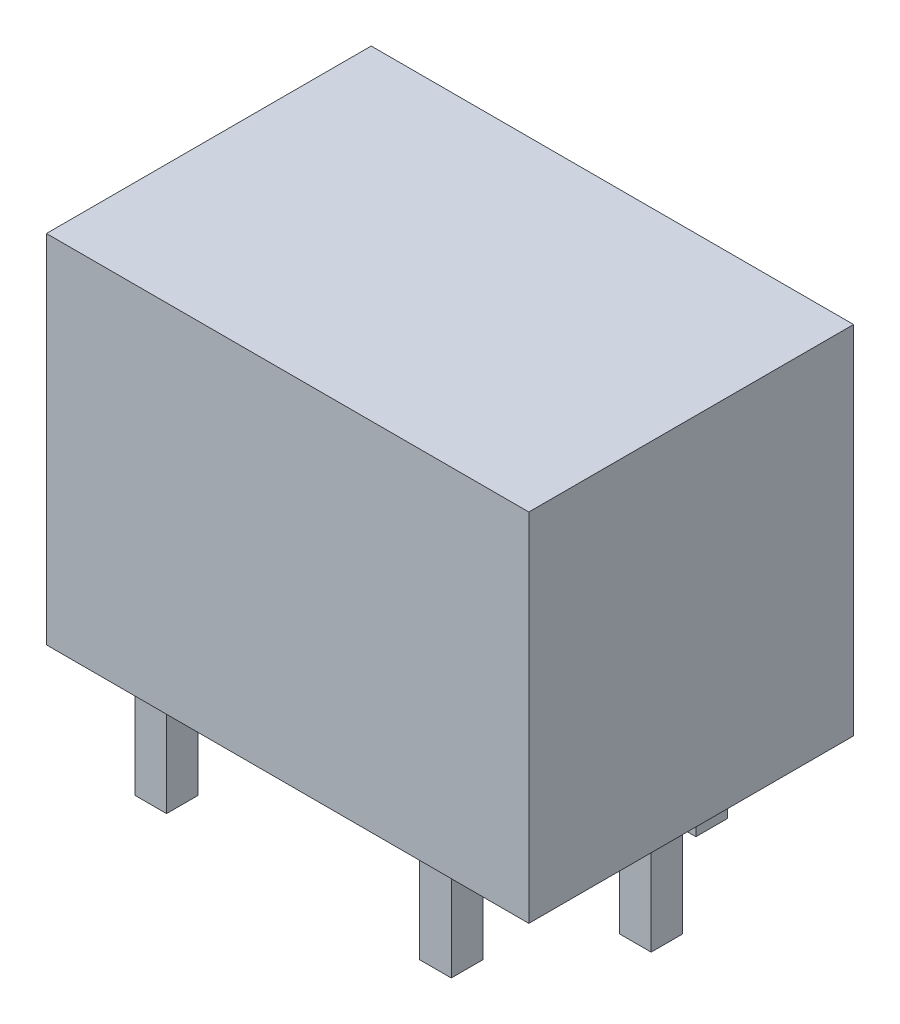
ISO-10303-21;
HEADER;
FILE_DESCRIPTION(('STEP AP214'),'2;1');
FILE_NAME('part.step','',(''),(''),'','','');
FILE_SCHEMA(('AUTOMOTIVE_DESIGN { 1 0 10303 214 1 1 1 1 }'));
ENDSEC;
DATA;
#1=APPLICATION_CONTEXT('core data for automotive mechanical design processes');
#2=APPLICATION_PROTOCOL_DEFINITION('international standard','automotive_design',2000,#1);
#3=PRODUCT_CONTEXT('',#1,'mechanical');
#4=PRODUCT('Part','Part','',(#3));
#5=PRODUCT_RELATED_PRODUCT_CATEGORY('part','',(#4));
#6=PRODUCT_DEFINITION_FORMATION('','',#4);
#7=PRODUCT_DEFINITION_CONTEXT('part definition',#1,'design');
#8=PRODUCT_DEFINITION('design','',#6,#7);
#9=PRODUCT_DEFINITION_SHAPE('','',#8);
#10=(LENGTH_UNIT() NAMED_UNIT(*) SI_UNIT(.MILLI.,.METRE.));
#11=(NAMED_UNIT(*) PLANE_ANGLE_UNIT() SI_UNIT($,.RADIAN.));
#12=(NAMED_UNIT(*) SI_UNIT($,.STERADIAN.) SOLID_ANGLE_UNIT());
#13=UNCERTAINTY_MEASURE_WITH_UNIT(LENGTH_MEASURE(1.E-05),#10,'distance_accuracy_value','');
#14=(GEOMETRIC_REPRESENTATION_CONTEXT(3) GLOBAL_UNCERTAINTY_ASSIGNED_CONTEXT((#13)) GLOBAL_UNIT_ASSIGNED_CONTEXT((#10,
#11,#12)) REPRESENTATION_CONTEXT('',''));
#15=CARTESIAN_POINT('',(0.,0.,0.));
#16=DIRECTION('',(0.,0.,1.));
#17=DIRECTION('',(1.,0.,0.));
#18=AXIS2_PLACEMENT_3D('',#15,#16,#17);
#19=CARTESIAN_POINT('',(-7.65,0.,5.15));
#20=DIRECTION('',(0.,1.,0.));
#21=DIRECTION('',(0.,0.,1.));
#22=AXIS2_PLACEMENT_3D('',#19,#20,#21);
#23=PLANE('',#22);
#24=DIRECTION('',(1.,0.,0.));
#25=VECTOR('',#24,1.);
#26=CARTESIAN_POINT('',(-4.60999999999999,0.,-4.38));
#27=LINE('',#26,#25);
#28=CARTESIAN_POINT('',(-5.60999999999999,0.,-4.38));
#29=VERTEX_POINT('',#28);
#30=CARTESIAN_POINT('',(-4.60999999999999,0.,-4.38));
#31=VERTEX_POINT('',#30);
#32=EDGE_CURVE('E224',#29,#31,#27,.T.);
#33=ORIENTED_EDGE('',*,*,#32,.F.);
#34=DIRECTION('',(0.,0.,-1.));
#35=VECTOR('',#34,1.);
#36=CARTESIAN_POINT('',(-5.60999999999999,0.,-4.38));
#37=LINE('',#36,#35);
#38=CARTESIAN_POINT('',(-5.60999999999999,0.,-3.38));
#39=VERTEX_POINT('',#38);
#40=EDGE_CURVE('E233',#39,#29,#37,.T.);
#41=ORIENTED_EDGE('',*,*,#40,.F.);
#42=DIRECTION('',(-1.,0.,0.));
#43=VECTOR('',#42,1.);
#44=CARTESIAN_POINT('',(-4.60999999999999,0.,-3.38));
#45=LINE('',#44,#43);
#46=CARTESIAN_POINT('',(-4.61,0.,-3.38));
#47=VERTEX_POINT('',#46);
#48=EDGE_CURVE('E230',#47,#39,#45,.T.);
#49=ORIENTED_EDGE('',*,*,#48,.F.);
#50=DIRECTION('',(0.,0.,1.));
#51=VECTOR('',#50,1.);
#52=CARTESIAN_POINT('',(-4.60999999999999,0.,-4.38));
#53=LINE('',#52,#51);
#54=EDGE_CURVE('E227',#31,#47,#53,.T.);
#55=ORIENTED_EDGE('',*,*,#54,.F.);
#56=EDGE_LOOP('',(#33,#41,#49,#55));
#57=FACE_BOUND('',#56,.T.);
#58=DIRECTION('',(0.,0.,1.));
#59=VECTOR('',#58,1.);
#60=CARTESIAN_POINT('',(4.42000000000001,0.,4.38));
#61=LINE('',#60,#59);
#62=CARTESIAN_POINT('',(4.42000000000001,0.,3.38));
#63=VERTEX_POINT('',#62);
#64=CARTESIAN_POINT('',(4.42000000000001,0.,4.38));
#65=VERTEX_POINT('',#64);
#66=EDGE_CURVE('E290',#63,#65,#61,.T.);
#67=ORIENTED_EDGE('',*,*,#66,.F.);
#68=DIRECTION('',(1.,0.,0.));
#69=VECTOR('',#68,1.);
#70=CARTESIAN_POINT('',(4.42000000000001,0.,3.38));
#71=LINE('',#70,#69);
#72=CARTESIAN_POINT('',(3.42000000000001,0.,3.38));
#73=VERTEX_POINT('',#72);
#74=EDGE_CURVE('E299',#73,#63,#71,.T.);
#75=ORIENTED_EDGE('',*,*,#74,.F.);
#76=DIRECTION('',(0.,0.,-1.));
#77=VECTOR('',#76,1.);
#78=CARTESIAN_POINT('',(3.42000000000001,0.,4.38));
#79=LINE('',#78,#77);
#80=CARTESIAN_POINT('',(3.42000000000001,0.,4.38));
#81=VERTEX_POINT('',#80);
#82=EDGE_CURVE('E296',#81,#73,#79,.T.);
#83=ORIENTED_EDGE('',*,*,#82,.F.);
#84=DIRECTION('',(-1.,0.,0.));
#85=VECTOR('',#84,1.);
#86=CARTESIAN_POINT('',(4.42000000000001,0.,4.38));
#87=LINE('',#86,#85);
#88=EDGE_CURVE('E293',#65,#81,#87,.T.);
#89=ORIENTED_EDGE('',*,*,#88,.F.);
#90=EDGE_LOOP('',(#67,#75,#83,#89));
#91=FACE_BOUND('',#90,.T.);
#92=DIRECTION('',(0.,0.,1.));
#93=VECTOR('',#92,1.);
#94=CARTESIAN_POINT('',(-7.65,0.,-5.15));
#95=LINE('',#94,#93);
#96=CARTESIAN_POINT('',(-7.65,0.,-5.15));
#97=VERTEX_POINT('',#96);
#98=CARTESIAN_POINT('',(-7.65,0.,5.15));
#99=VERTEX_POINT('',#98);
#100=EDGE_CURVE('E356',#97,#99,#95,.T.);
#101=ORIENTED_EDGE('',*,*,#100,.F.);
#102=DIRECTION('',(-1.,0.,0.));
#103=VECTOR('',#102,1.);
#104=CARTESIAN_POINT('',(-7.65,0.,-5.15));
#105=LINE('',#104,#103);
#106=CARTESIAN_POINT('',(7.65000000000001,0.,-5.15));
#107=VERTEX_POINT('',#106);
#108=EDGE_CURVE('E363',#107,#97,#105,.T.);
#109=ORIENTED_EDGE('',*,*,#108,.F.);
#110=DIRECTION('',(0.,0.,-1.));
#111=VECTOR('',#110,1.);
#112=CARTESIAN_POINT('',(7.65000000000001,0.,-5.15));
#113=LINE('',#112,#111);
#114=CARTESIAN_POINT('',(7.65000000000001,0.,5.15));
#115=VERTEX_POINT('',#114);
#116=EDGE_CURVE('E361',#115,#107,#113,.T.);
#117=ORIENTED_EDGE('',*,*,#116,.F.);
#118=DIRECTION('',(1.,0.,0.));
#119=VECTOR('',#118,1.);
#120=CARTESIAN_POINT('',(-7.65,0.,5.15));
#121=LINE('',#120,#119);
#122=EDGE_CURVE('E359',#99,#115,#121,.T.);
#123=ORIENTED_EDGE('',*,*,#122,.F.);
#124=EDGE_LOOP('',(#101,#109,#117,#123));
#125=FACE_BOUND('',#124,.T.);
#126=DIRECTION('',(0.,0.,1.));
#127=VECTOR('',#126,1.);
#128=CARTESIAN_POINT('',(6.88000000000001,0.,-0.499999999999999));
#129=LINE('',#128,#127);
#130=CARTESIAN_POINT('',(6.88000000000001,0.,-0.499999999999999));
#131=VERTEX_POINT('',#130);
#132=CARTESIAN_POINT('',(6.88000000000001,0.,0.500000000000008));
#133=VERTEX_POINT('',#132);
#134=EDGE_CURVE('E323',#131,#133,#129,.T.);
#135=ORIENTED_EDGE('',*,*,#134,.F.);
#136=DIRECTION('',(1.,0.,0.));
#137=VECTOR('',#136,1.);
#138=CARTESIAN_POINT('',(6.88000000000001,0.,-0.499999999999999));
#139=LINE('',#138,#137);
#140=CARTESIAN_POINT('',(5.88000000000001,0.,-0.499999999999999));
#141=VERTEX_POINT('',#140);
#142=EDGE_CURVE('E332',#141,#131,#139,.T.);
#143=ORIENTED_EDGE('',*,*,#142,.F.);
#144=DIRECTION('',(0.,0.,-1.));
#145=VECTOR('',#144,1.);
#146=CARTESIAN_POINT('',(5.88000000000001,0.,-0.499999999999999));
#147=LINE('',#146,#145);
#148=CARTESIAN_POINT('',(5.88000000000001,0.,0.500000000000008));
#149=VERTEX_POINT('',#148);
#150=EDGE_CURVE('E329',#149,#141,#147,.T.);
#151=ORIENTED_EDGE('',*,*,#150,.F.);
#152=DIRECTION('',(-1.,0.,0.));
#153=VECTOR('',#152,1.);
#154=CARTESIAN_POINT('',(6.88000000000001,0.,0.500000000000008));
#155=LINE('',#154,#153);
#156=EDGE_CURVE('E326',#133,#149,#155,.T.);
#157=ORIENTED_EDGE('',*,*,#156,.F.);
#158=EDGE_LOOP('',(#135,#143,#151,#157));
#159=FACE_BOUND('',#158,.T.);
#160=DIRECTION('',(0.,0.,1.));
#161=VECTOR('',#160,1.);
#162=CARTESIAN_POINT('',(-4.61,0.,4.38));
#163=LINE('',#162,#161);
#164=CARTESIAN_POINT('',(-4.61,0.,3.38));
#165=VERTEX_POINT('',#164);
#166=CARTESIAN_POINT('',(-4.61,0.,4.38));
#167=VERTEX_POINT('',#166);
#168=EDGE_CURVE('E257',#165,#167,#163,.T.);
#169=ORIENTED_EDGE('',*,*,#168,.F.);
#170=DIRECTION('',(1.,0.,0.));
#171=VECTOR('',#170,1.);
#172=CARTESIAN_POINT('',(-4.61,0.,3.38));
#173=LINE('',#172,#171);
#174=CARTESIAN_POINT('',(-5.61,0.,3.38));
#175=VERTEX_POINT('',#174);
#176=EDGE_CURVE('E266',#175,#165,#173,.T.);
#177=ORIENTED_EDGE('',*,*,#176,.F.);
#178=DIRECTION('',(0.,0.,-1.));
#179=VECTOR('',#178,1.);
#180=CARTESIAN_POINT('',(-5.61,0.,4.38));
#181=LINE('',#180,#179);
#182=CARTESIAN_POINT('',(-5.61,0.,4.38));
#183=VERTEX_POINT('',#182);
#184=EDGE_CURVE('E263',#183,#175,#181,.T.);
#185=ORIENTED_EDGE('',*,*,#184,.F.);
#186=DIRECTION('',(-1.,0.,0.));
#187=VECTOR('',#186,1.);
#188=CARTESIAN_POINT('',(-4.61,0.,4.38));
#189=LINE('',#188,#187);
#190=EDGE_CURVE('E260',#167,#183,#189,.T.);
#191=ORIENTED_EDGE('',*,*,#190,.F.);
#192=EDGE_LOOP('',(#169,#177,#185,#191));
#193=FACE_BOUND('',#192,.T.);
#194=DIRECTION('',(1.,0.,0.));
#195=VECTOR('',#194,1.);
#196=CARTESIAN_POINT('',(4.42000000000001,0.,-4.38));
#197=LINE('',#196,#195);
#198=CARTESIAN_POINT('',(3.42000000000001,0.,-4.38));
#199=VERTEX_POINT('',#198);
#200=CARTESIAN_POINT('',(4.42000000000001,0.,-4.38));
#201=VERTEX_POINT('',#200);
#202=EDGE_CURVE('E192',#199,#201,#197,.T.);
#203=ORIENTED_EDGE('',*,*,#202,.F.);
#204=DIRECTION('',(0.,0.,-1.));
#205=VECTOR('',#204,1.);
#206=CARTESIAN_POINT('',(3.42000000000001,0.,-4.38));
#207=LINE('',#206,#205);
#208=CARTESIAN_POINT('',(3.42000000000001,0.,-3.38));
#209=VERTEX_POINT('',#208);
#210=EDGE_CURVE('E194',#209,#199,#207,.T.);
#211=ORIENTED_EDGE('',*,*,#210,.F.);
#212=DIRECTION('',(-1.,0.,0.));
#213=VECTOR('',#212,1.);
#214=CARTESIAN_POINT('',(4.42000000000001,0.,-3.38));
#215=LINE('',#214,#213);
#216=CARTESIAN_POINT('',(4.42000000000001,0.,-3.38));
#217=VERTEX_POINT('',#216);
#218=EDGE_CURVE('E55',#217,#209,#215,.T.);
#219=ORIENTED_EDGE('',*,*,#218,.F.);
#220=DIRECTION('',(0.,0.,1.));
#221=VECTOR('',#220,1.);
#222=CARTESIAN_POINT('',(4.42000000000001,0.,-4.38));
#223=LINE('',#222,#221);
#224=EDGE_CURVE('E50',#201,#217,#223,.T.);
#225=ORIENTED_EDGE('',*,*,#224,.F.);
#226=EDGE_LOOP('',(#203,#211,#219,#225));
#227=FACE_BOUND('',#226,.T.);
#228=ADVANCED_FACE('F35',(#57,#91,#125,#159,#193,#227),#23,.F.);
#229=CARTESIAN_POINT('',(-7.65,11.3,-5.15));
#230=DIRECTION('',(1.,0.,0.));
#231=DIRECTION('',(0.,0.,-1.));
#232=AXIS2_PLACEMENT_3D('',#229,#230,#231);
#233=PLANE('',#232);
#234=ORIENTED_EDGE('',*,*,#100,.T.);
#235=DIRECTION('',(0.,-1.,0.));
#236=VECTOR('',#235,1.);
#237=CARTESIAN_POINT('',(-7.65,11.3,5.15));
#238=LINE('',#237,#236);
#239=CARTESIAN_POINT('',(-7.65,11.3,5.15));
#240=VERTEX_POINT('',#239);
#241=EDGE_CURVE('E11',#240,#99,#238,.T.);
#242=ORIENTED_EDGE('',*,*,#241,.F.);
#243=DIRECTION('',(0.,0.,1.));
#244=VECTOR('',#243,1.);
#245=CARTESIAN_POINT('',(-7.65,11.3,-5.15));
#246=LINE('',#245,#244);
#247=CARTESIAN_POINT('',(-7.65,11.3,-5.15));
#248=VERTEX_POINT('',#247);
#249=EDGE_CURVE('E365',#248,#240,#246,.T.);
#250=ORIENTED_EDGE('',*,*,#249,.F.);
#251=DIRECTION('',(0.,-1.,0.));
#252=VECTOR('',#251,1.);
#253=CARTESIAN_POINT('',(-7.65,11.3,-5.15));
#254=LINE('',#253,#252);
#255=EDGE_CURVE('E374',#248,#97,#254,.T.);
#256=ORIENTED_EDGE('',*,*,#255,.T.);
#257=EDGE_LOOP('',(#234,#242,#250,#256));
#258=FACE_BOUND('',#257,.T.);
#259=ADVANCED_FACE('F37',(#258),#233,.F.);
#260=CARTESIAN_POINT('',(-7.65,11.3,5.15));
#261=DIRECTION('',(0.,0.,-1.));
#262=DIRECTION('',(-1.,0.,0.));
#263=AXIS2_PLACEMENT_3D('',#260,#261,#262);
#264=PLANE('',#263);
#265=ORIENTED_EDGE('',*,*,#122,.T.);
#266=DIRECTION('',(0.,-1.,0.));
#267=VECTOR('',#266,1.);
#268=CARTESIAN_POINT('',(7.65000000000001,11.3,5.15));
#269=LINE('',#268,#267);
#270=CARTESIAN_POINT('',(7.65000000000001,11.3,5.15));
#271=VERTEX_POINT('',#270);
#272=EDGE_CURVE('E43',#271,#115,#269,.T.);
#273=ORIENTED_EDGE('',*,*,#272,.F.);
#274=DIRECTION('',(1.,0.,0.));
#275=VECTOR('',#274,1.);
#276=CARTESIAN_POINT('',(-7.65,11.3,5.15));
#277=LINE('',#276,#275);
#278=EDGE_CURVE('E368',#240,#271,#277,.T.);
#279=ORIENTED_EDGE('',*,*,#278,.F.);
#280=ORIENTED_EDGE('',*,*,#241,.T.);
#281=EDGE_LOOP('',(#265,#273,#279,#280));
#282=FACE_BOUND('',#281,.T.);
#283=ADVANCED_FACE('F400',(#282),#264,.F.);
#284=CARTESIAN_POINT('',(7.65000000000001,11.3,-5.15));
#285=DIRECTION('',(-1.,0.,0.));
#286=DIRECTION('',(0.,0.,1.));
#287=AXIS2_PLACEMENT_3D('',#284,#285,#286);
#288=PLANE('',#287);
#289=ORIENTED_EDGE('',*,*,#116,.T.);
#290=DIRECTION('',(0.,-1.,0.));
#291=VECTOR('',#290,1.);
#292=CARTESIAN_POINT('',(7.65000000000001,11.3,-5.15));
#293=LINE('',#292,#291);
#294=CARTESIAN_POINT('',(7.65000000000001,11.3,-5.15));
#295=VERTEX_POINT('',#294);
#296=EDGE_CURVE('E377',#295,#107,#293,.T.);
#297=ORIENTED_EDGE('',*,*,#296,.F.);
#298=DIRECTION('',(0.,0.,-1.));
#299=VECTOR('',#298,1.);
#300=CARTESIAN_POINT('',(7.65000000000001,11.3,-5.15));
#301=LINE('',#300,#299);
#302=EDGE_CURVE('E370',#271,#295,#301,.T.);
#303=ORIENTED_EDGE('',*,*,#302,.F.);
#304=ORIENTED_EDGE('',*,*,#272,.T.);
#305=EDGE_LOOP('',(#289,#297,#303,#304));
#306=FACE_BOUND('',#305,.T.);
#307=ADVANCED_FACE('F384',(#306),#288,.F.);
#308=CARTESIAN_POINT('',(-7.65,11.3,-5.15));
#309=DIRECTION('',(0.,0.,1.));
#310=DIRECTION('',(1.,0.,0.));
#311=AXIS2_PLACEMENT_3D('',#308,#309,#310);
#312=PLANE('',#311);
#313=ORIENTED_EDGE('',*,*,#108,.T.);
#314=ORIENTED_EDGE('',*,*,#255,.F.);
#315=DIRECTION('',(-1.,0.,0.));
#316=VECTOR('',#315,1.);
#317=CARTESIAN_POINT('',(-7.65,11.3,-5.15));
#318=LINE('',#317,#316);
#319=EDGE_CURVE('E372',#295,#248,#318,.T.);
#320=ORIENTED_EDGE('',*,*,#319,.F.);
#321=ORIENTED_EDGE('',*,*,#296,.T.);
#322=EDGE_LOOP('',(#313,#314,#320,#321));
#323=FACE_BOUND('',#322,.T.);
#324=ADVANCED_FACE('F393',(#323),#312,.F.);
#325=CARTESIAN_POINT('',(-7.65,11.3,5.15));
#326=DIRECTION('',(0.,1.,0.));
#327=DIRECTION('',(0.,0.,1.));
#328=AXIS2_PLACEMENT_3D('',#325,#326,#327);
#329=PLANE('',#328);
#330=ORIENTED_EDGE('',*,*,#249,.T.);
#331=ORIENTED_EDGE('',*,*,#278,.T.);
#332=ORIENTED_EDGE('',*,*,#302,.T.);
#333=ORIENTED_EDGE('',*,*,#319,.T.);
#334=EDGE_LOOP('',(#330,#331,#332,#333));
#335=FACE_BOUND('',#334,.T.);
#336=ADVANCED_FACE('F399',(#335),#329,.T.);
#337=CARTESIAN_POINT('',(6.88000000000001,-3.5,-0.499999999999999));
#338=DIRECTION('',(-1.,0.,0.));
#339=DIRECTION('',(0.,0.,1.));
#340=AXIS2_PLACEMENT_3D('',#337,#338,#339);
#341=PLANE('',#340);
#342=ORIENTED_EDGE('',*,*,#134,.T.);
#343=DIRECTION('',(0.,1.,0.));
#344=VECTOR('',#343,1.);
#345=CARTESIAN_POINT('',(6.88000000000001,-3.5,0.500000000000008));
#346=LINE('',#345,#344);
#347=CARTESIAN_POINT('',(6.88000000000001,-3.5,0.500000000000008));
#348=VERTEX_POINT('',#347);
#349=EDGE_CURVE('E353',#348,#133,#346,.T.);
#350=ORIENTED_EDGE('',*,*,#349,.F.);
#351=DIRECTION('',(0.,0.,1.));
#352=VECTOR('',#351,1.);
#353=CARTESIAN_POINT('',(6.88000000000001,-3.5,-0.499999999999999));
#354=LINE('',#353,#352);
#355=CARTESIAN_POINT('',(6.88000000000001,-3.5,-0.499999999999999));
#356=VERTEX_POINT('',#355);
#357=EDGE_CURVE('E335',#356,#348,#354,.T.);
#358=ORIENTED_EDGE('',*,*,#357,.F.);
#359=DIRECTION('',(0.,1.,0.));
#360=VECTOR('',#359,1.);
#361=CARTESIAN_POINT('',(6.88000000000001,-3.5,-0.499999999999999));
#362=LINE('',#361,#360);
#363=EDGE_CURVE('E344',#356,#131,#362,.T.);
#364=ORIENTED_EDGE('',*,*,#363,.T.);
#365=EDGE_LOOP('',(#342,#350,#358,#364));
#366=FACE_BOUND('',#365,.T.);
#367=ADVANCED_FACE('F415',(#366),#341,.F.);
#368=CARTESIAN_POINT('',(6.88000000000001,-3.5,0.500000000000008));
#369=DIRECTION('',(0.,0.,-1.));
#370=DIRECTION('',(-1.,0.,0.));
#371=AXIS2_PLACEMENT_3D('',#368,#369,#370);
#372=PLANE('',#371);
#373=ORIENTED_EDGE('',*,*,#156,.T.);
#374=DIRECTION('',(0.,1.,0.));
#375=VECTOR('',#374,1.);
#376=CARTESIAN_POINT('',(5.88000000000001,-3.5,0.500000000000008));
#377=LINE('',#376,#375);
#378=CARTESIAN_POINT('',(5.88000000000001,-3.5,0.500000000000008));
#379=VERTEX_POINT('',#378);
#380=EDGE_CURVE('E350',#379,#149,#377,.T.);
#381=ORIENTED_EDGE('',*,*,#380,.F.);
#382=DIRECTION('',(-1.,0.,0.));
#383=VECTOR('',#382,1.);
#384=CARTESIAN_POINT('',(6.88000000000001,-3.5,0.500000000000008));
#385=LINE('',#384,#383);
#386=EDGE_CURVE('E338',#348,#379,#385,.T.);
#387=ORIENTED_EDGE('',*,*,#386,.F.);
#388=ORIENTED_EDGE('',*,*,#349,.T.);
#389=EDGE_LOOP('',(#373,#381,#387,#388));
#390=FACE_BOUND('',#389,.T.);
#391=ADVANCED_FACE('F434',(#390),#372,.F.);
#392=CARTESIAN_POINT('',(5.88000000000001,-3.5,-0.499999999999999));
#393=DIRECTION('',(1.,0.,0.));
#394=DIRECTION('',(0.,0.,-1.));
#395=AXIS2_PLACEMENT_3D('',#392,#393,#394);
#396=PLANE('',#395);
#397=ORIENTED_EDGE('',*,*,#150,.T.);
#398=DIRECTION('',(0.,1.,0.));
#399=VECTOR('',#398,1.);
#400=CARTESIAN_POINT('',(5.88000000000001,-3.5,-0.499999999999999));
#401=LINE('',#400,#399);
#402=CARTESIAN_POINT('',(5.88000000000001,-3.5,-0.499999999999999));
#403=VERTEX_POINT('',#402);
#404=EDGE_CURVE('E347',#403,#141,#401,.T.);
#405=ORIENTED_EDGE('',*,*,#404,.F.);
#406=DIRECTION('',(0.,0.,-1.));
#407=VECTOR('',#406,1.);
#408=CARTESIAN_POINT('',(5.88000000000001,-3.5,-0.499999999999999));
#409=LINE('',#408,#407);
#410=EDGE_CURVE('E340',#379,#403,#409,.T.);
#411=ORIENTED_EDGE('',*,*,#410,.F.);
#412=ORIENTED_EDGE('',*,*,#380,.T.);
#413=EDGE_LOOP('',(#397,#405,#411,#412));
#414=FACE_BOUND('',#413,.T.);
#415=ADVANCED_FACE('F441',(#414),#396,.F.);
#416=CARTESIAN_POINT('',(6.88000000000001,-3.5,-0.499999999999999));
#417=DIRECTION('',(0.,0.,1.));
#418=DIRECTION('',(1.,0.,0.));
#419=AXIS2_PLACEMENT_3D('',#416,#417,#418);
#420=PLANE('',#419);
#421=ORIENTED_EDGE('',*,*,#142,.T.);
#422=ORIENTED_EDGE('',*,*,#363,.F.);
#423=DIRECTION('',(1.,0.,0.));
#424=VECTOR('',#423,1.);
#425=CARTESIAN_POINT('',(6.88000000000001,-3.5,-0.499999999999999));
#426=LINE('',#425,#424);
#427=EDGE_CURVE('E342',#403,#356,#426,.T.);
#428=ORIENTED_EDGE('',*,*,#427,.F.);
#429=ORIENTED_EDGE('',*,*,#404,.T.);
#430=EDGE_LOOP('',(#421,#422,#428,#429));
#431=FACE_BOUND('',#430,.T.);
#432=ADVANCED_FACE('F448',(#431),#420,.F.);
#433=CARTESIAN_POINT('',(6.88000000000001,-3.5,0.500000000000008));
#434=DIRECTION('',(0.,-1.,0.));
#435=DIRECTION('',(0.,0.,-1.));
#436=AXIS2_PLACEMENT_3D('',#433,#434,#435);
#437=PLANE('',#436);
#438=ORIENTED_EDGE('',*,*,#357,.T.);
#439=ORIENTED_EDGE('',*,*,#386,.T.);
#440=ORIENTED_EDGE('',*,*,#410,.T.);
#441=ORIENTED_EDGE('',*,*,#427,.T.);
#442=EDGE_LOOP('',(#438,#439,#440,#441));
#443=FACE_BOUND('',#442,.T.);
#444=ADVANCED_FACE('F456',(#443),#437,.T.);
#445=CARTESIAN_POINT('',(4.42000000000001,-3.5,4.38));
#446=DIRECTION('',(-1.,0.,0.));
#447=DIRECTION('',(0.,0.,1.));
#448=AXIS2_PLACEMENT_3D('',#445,#446,#447);
#449=PLANE('',#448);
#450=ORIENTED_EDGE('',*,*,#66,.T.);
#451=DIRECTION('',(0.,1.,0.));
#452=VECTOR('',#451,1.);
#453=CARTESIAN_POINT('',(4.42000000000001,-3.5,4.38));
#454=LINE('',#453,#452);
#455=CARTESIAN_POINT('',(4.42000000000001,-3.5,4.38));
#456=VERTEX_POINT('',#455);
#457=EDGE_CURVE('E320',#456,#65,#454,.T.);
#458=ORIENTED_EDGE('',*,*,#457,.F.);
#459=DIRECTION('',(0.,0.,1.));
#460=VECTOR('',#459,1.);
#461=CARTESIAN_POINT('',(4.42000000000001,-3.5,4.38));
#462=LINE('',#461,#460);
#463=CARTESIAN_POINT('',(4.42000000000001,-3.5,3.38));
#464=VERTEX_POINT('',#463);
#465=EDGE_CURVE('E302',#464,#456,#462,.T.);
#466=ORIENTED_EDGE('',*,*,#465,.F.);
#467=DIRECTION('',(0.,1.,0.));
#468=VECTOR('',#467,1.);
#469=CARTESIAN_POINT('',(4.42000000000001,-3.5,3.38));
#470=LINE('',#469,#468);
#471=EDGE_CURVE('E311',#464,#63,#470,.T.);
#472=ORIENTED_EDGE('',*,*,#471,.T.);
#473=EDGE_LOOP('',(#450,#458,#466,#472));
#474=FACE_BOUND('',#473,.T.);
#475=ADVANCED_FACE('F464',(#474),#449,.F.);
#476=CARTESIAN_POINT('',(4.42000000000001,-3.5,4.38));
#477=DIRECTION('',(0.,0.,-1.));
#478=DIRECTION('',(-1.,0.,0.));
#479=AXIS2_PLACEMENT_3D('',#476,#477,#478);
#480=PLANE('',#479);
#481=ORIENTED_EDGE('',*,*,#88,.T.);
#482=DIRECTION('',(0.,1.,0.));
#483=VECTOR('',#482,1.);
#484=CARTESIAN_POINT('',(3.42000000000001,-3.5,4.38));
#485=LINE('',#484,#483);
#486=CARTESIAN_POINT('',(3.42000000000001,-3.5,4.38));
#487=VERTEX_POINT('',#486);
#488=EDGE_CURVE('E317',#487,#81,#485,.T.);
#489=ORIENTED_EDGE('',*,*,#488,.F.);
#490=DIRECTION('',(-1.,0.,0.));
#491=VECTOR('',#490,1.);
#492=CARTESIAN_POINT('',(4.42000000000001,-3.5,4.38));
#493=LINE('',#492,#491);
#494=EDGE_CURVE('E305',#456,#487,#493,.T.);
#495=ORIENTED_EDGE('',*,*,#494,.F.);
#496=ORIENTED_EDGE('',*,*,#457,.T.);
#497=EDGE_LOOP('',(#481,#489,#495,#496));
#498=FACE_BOUND('',#497,.T.);
#499=ADVANCED_FACE('F472',(#498),#480,.F.);
#500=CARTESIAN_POINT('',(3.42000000000001,-3.5,4.38));
#501=DIRECTION('',(1.,0.,0.));
#502=DIRECTION('',(0.,0.,-1.));
#503=AXIS2_PLACEMENT_3D('',#500,#501,#502);
#504=PLANE('',#503);
#505=ORIENTED_EDGE('',*,*,#82,.T.);
#506=DIRECTION('',(0.,1.,0.));
#507=VECTOR('',#506,1.);
#508=CARTESIAN_POINT('',(3.42000000000001,-3.5,3.38));
#509=LINE('',#508,#507);
#510=CARTESIAN_POINT('',(3.42000000000001,-3.5,3.38));
#511=VERTEX_POINT('',#510);
#512=EDGE_CURVE('E314',#511,#73,#509,.T.);
#513=ORIENTED_EDGE('',*,*,#512,.F.);
#514=DIRECTION('',(0.,0.,-1.));
#515=VECTOR('',#514,1.);
#516=CARTESIAN_POINT('',(3.42000000000001,-3.5,4.38));
#517=LINE('',#516,#515);
#518=EDGE_CURVE('E307',#487,#511,#517,.T.);
#519=ORIENTED_EDGE('',*,*,#518,.F.);
#520=ORIENTED_EDGE('',*,*,#488,.T.);
#521=EDGE_LOOP('',(#505,#513,#519,#520));
#522=FACE_BOUND('',#521,.T.);
#523=ADVANCED_FACE('F480',(#522),#504,.F.);
#524=CARTESIAN_POINT('',(4.42000000000001,-3.5,3.38));
#525=DIRECTION('',(0.,0.,1.));
#526=DIRECTION('',(1.,0.,0.));
#527=AXIS2_PLACEMENT_3D('',#524,#525,#526);
#528=PLANE('',#527);
#529=ORIENTED_EDGE('',*,*,#74,.T.);
#530=ORIENTED_EDGE('',*,*,#471,.F.);
#531=DIRECTION('',(1.,0.,0.));
#532=VECTOR('',#531,1.);
#533=CARTESIAN_POINT('',(4.42000000000001,-3.5,3.38));
#534=LINE('',#533,#532);
#535=EDGE_CURVE('E309',#511,#464,#534,.T.);
#536=ORIENTED_EDGE('',*,*,#535,.F.);
#537=ORIENTED_EDGE('',*,*,#512,.T.);
#538=EDGE_LOOP('',(#529,#530,#536,#537));
#539=FACE_BOUND('',#538,.T.);
#540=ADVANCED_FACE('F488',(#539),#528,.F.);
#541=CARTESIAN_POINT('',(4.42000000000001,-3.5,4.38));
#542=DIRECTION('',(0.,1.,0.));
#543=DIRECTION('',(0.,0.,1.));
#544=AXIS2_PLACEMENT_3D('',#541,#542,#543);
#545=PLANE('',#544);
#546=ORIENTED_EDGE('',*,*,#465,.T.);
#547=ORIENTED_EDGE('',*,*,#494,.T.);
#548=ORIENTED_EDGE('',*,*,#518,.T.);
#549=ORIENTED_EDGE('',*,*,#535,.T.);
#550=EDGE_LOOP('',(#546,#547,#548,#549));
#551=FACE_BOUND('',#550,.T.);
#552=ADVANCED_FACE('F496',(#551),#545,.F.);
#553=CARTESIAN_POINT('',(-4.61,-3.5,4.38));
#554=DIRECTION('',(-1.,0.,0.));
#555=DIRECTION('',(0.,0.,1.));
#556=AXIS2_PLACEMENT_3D('',#553,#554,#555);
#557=PLANE('',#556);
#558=ORIENTED_EDGE('',*,*,#168,.T.);
#559=DIRECTION('',(0.,1.,0.));
#560=VECTOR('',#559,1.);
#561=CARTESIAN_POINT('',(-4.61,-3.5,4.38));
#562=LINE('',#561,#560);
#563=CARTESIAN_POINT('',(-4.61,-3.5,4.38));
#564=VERTEX_POINT('',#563);
#565=EDGE_CURVE('E287',#564,#167,#562,.T.);
#566=ORIENTED_EDGE('',*,*,#565,.F.);
#567=DIRECTION('',(0.,0.,1.));
#568=VECTOR('',#567,1.);
#569=CARTESIAN_POINT('',(-4.61,-3.5,4.38));
#570=LINE('',#569,#568);
#571=CARTESIAN_POINT('',(-4.61,-3.5,3.38));
#572=VERTEX_POINT('',#571);
#573=EDGE_CURVE('E269',#572,#564,#570,.T.);
#574=ORIENTED_EDGE('',*,*,#573,.F.);
#575=DIRECTION('',(0.,1.,0.));
#576=VECTOR('',#575,1.);
#577=CARTESIAN_POINT('',(-4.61,-3.5,3.38));
#578=LINE('',#577,#576);
#579=EDGE_CURVE('E278',#572,#165,#578,.T.);
#580=ORIENTED_EDGE('',*,*,#579,.T.);
#581=EDGE_LOOP('',(#558,#566,#574,#580));
#582=FACE_BOUND('',#581,.T.);
#583=ADVANCED_FACE('F504',(#582),#557,.F.);
#584=CARTESIAN_POINT('',(-4.61,-3.5,4.38));
#585=DIRECTION('',(0.,0.,-1.));
#586=DIRECTION('',(-1.,0.,0.));
#587=AXIS2_PLACEMENT_3D('',#584,#585,#586);
#588=PLANE('',#587);
#589=ORIENTED_EDGE('',*,*,#190,.T.);
#590=DIRECTION('',(0.,1.,0.));
#591=VECTOR('',#590,1.);
#592=CARTESIAN_POINT('',(-5.61,-3.5,4.38));
#593=LINE('',#592,#591);
#594=CARTESIAN_POINT('',(-5.61,-3.5,4.38));
#595=VERTEX_POINT('',#594);
#596=EDGE_CURVE('E284',#595,#183,#593,.T.);
#597=ORIENTED_EDGE('',*,*,#596,.F.);
#598=DIRECTION('',(-1.,0.,0.));
#599=VECTOR('',#598,1.);
#600=CARTESIAN_POINT('',(-4.61,-3.5,4.38));
#601=LINE('',#600,#599);
#602=EDGE_CURVE('E272',#564,#595,#601,.T.);
#603=ORIENTED_EDGE('',*,*,#602,.F.);
#604=ORIENTED_EDGE('',*,*,#565,.T.);
#605=EDGE_LOOP('',(#589,#597,#603,#604));
#606=FACE_BOUND('',#605,.T.);
#607=ADVANCED_FACE('F512',(#606),#588,.F.);
#608=CARTESIAN_POINT('',(-5.61,-3.5,4.38));
#609=DIRECTION('',(1.,0.,0.));
#610=DIRECTION('',(0.,0.,-1.));
#611=AXIS2_PLACEMENT_3D('',#608,#609,#610);
#612=PLANE('',#611);
#613=ORIENTED_EDGE('',*,*,#184,.T.);
#614=DIRECTION('',(0.,1.,0.));
#615=VECTOR('',#614,1.);
#616=CARTESIAN_POINT('',(-5.61,-3.5,3.38));
#617=LINE('',#616,#615);
#618=CARTESIAN_POINT('',(-5.61,-3.5,3.38));
#619=VERTEX_POINT('',#618);
#620=EDGE_CURVE('E281',#619,#175,#617,.T.);
#621=ORIENTED_EDGE('',*,*,#620,.F.);
#622=DIRECTION('',(0.,0.,-1.));
#623=VECTOR('',#622,1.);
#624=CARTESIAN_POINT('',(-5.61,-3.5,4.38));
#625=LINE('',#624,#623);
#626=EDGE_CURVE('E274',#595,#619,#625,.T.);
#627=ORIENTED_EDGE('',*,*,#626,.F.);
#628=ORIENTED_EDGE('',*,*,#596,.T.);
#629=EDGE_LOOP('',(#613,#621,#627,#628));
#630=FACE_BOUND('',#629,.T.);
#631=ADVANCED_FACE('F520',(#630),#612,.F.);
#632=CARTESIAN_POINT('',(-4.61,-3.5,3.38));
#633=DIRECTION('',(0.,0.,1.));
#634=DIRECTION('',(1.,0.,0.));
#635=AXIS2_PLACEMENT_3D('',#632,#633,#634);
#636=PLANE('',#635);
#637=ORIENTED_EDGE('',*,*,#176,.T.);
#638=ORIENTED_EDGE('',*,*,#579,.F.);
#639=DIRECTION('',(1.,0.,0.));
#640=VECTOR('',#639,1.);
#641=CARTESIAN_POINT('',(-4.61,-3.5,3.38));
#642=LINE('',#641,#640);
#643=EDGE_CURVE('E276',#619,#572,#642,.T.);
#644=ORIENTED_EDGE('',*,*,#643,.F.);
#645=ORIENTED_EDGE('',*,*,#620,.T.);
#646=EDGE_LOOP('',(#637,#638,#644,#645));
#647=FACE_BOUND('',#646,.T.);
#648=ADVANCED_FACE('F528',(#647),#636,.F.);
#649=CARTESIAN_POINT('',(-4.61,-3.5,3.38));
#650=DIRECTION('',(0.,1.,0.));
#651=DIRECTION('',(0.,0.,1.));
#652=AXIS2_PLACEMENT_3D('',#649,#650,#651);
#653=PLANE('',#652);
#654=ORIENTED_EDGE('',*,*,#573,.T.);
#655=ORIENTED_EDGE('',*,*,#602,.T.);
#656=ORIENTED_EDGE('',*,*,#626,.T.);
#657=ORIENTED_EDGE('',*,*,#643,.T.);
#658=EDGE_LOOP('',(#654,#655,#656,#657));
#659=FACE_BOUND('',#658,.T.);
#660=ADVANCED_FACE('F536',(#659),#653,.F.);
#661=CARTESIAN_POINT('',(-4.60999999999999,-3.5,-4.38));
#662=DIRECTION('',(0.,0.,1.));
#663=DIRECTION('',(1.,0.,0.));
#664=AXIS2_PLACEMENT_3D('',#661,#662,#663);
#665=PLANE('',#664);
#666=ORIENTED_EDGE('',*,*,#32,.T.);
#667=DIRECTION('',(0.,1.,0.));
#668=VECTOR('',#667,1.);
#669=CARTESIAN_POINT('',(-4.60999999999999,-3.5,-4.38));
#670=LINE('',#669,#668);
#671=CARTESIAN_POINT('',(-4.60999999999999,-3.5,-4.38));
#672=VERTEX_POINT('',#671);
#673=EDGE_CURVE('E254',#672,#31,#670,.T.);
#674=ORIENTED_EDGE('',*,*,#673,.F.);
#675=DIRECTION('',(1.,0.,0.));
#676=VECTOR('',#675,1.);
#677=CARTESIAN_POINT('',(-4.60999999999999,-3.5,-4.38));
#678=LINE('',#677,#676);
#679=CARTESIAN_POINT('',(-5.60999999999999,-3.5,-4.38));
#680=VERTEX_POINT('',#679);
#681=EDGE_CURVE('E236',#680,#672,#678,.T.);
#682=ORIENTED_EDGE('',*,*,#681,.F.);
#683=DIRECTION('',(0.,1.,0.));
#684=VECTOR('',#683,1.);
#685=CARTESIAN_POINT('',(-5.60999999999999,-3.5,-4.38));
#686=LINE('',#685,#684);
#687=EDGE_CURVE('E245',#680,#29,#686,.T.);
#688=ORIENTED_EDGE('',*,*,#687,.T.);
#689=EDGE_LOOP('',(#666,#674,#682,#688));
#690=FACE_BOUND('',#689,.T.);
#691=ADVANCED_FACE('F544',(#690),#665,.F.);
#692=CARTESIAN_POINT('',(-4.60999999999999,-3.5,-4.38));
#693=DIRECTION('',(-1.,0.,0.));
#694=DIRECTION('',(0.,0.,1.));
#695=AXIS2_PLACEMENT_3D('',#692,#693,#694);
#696=PLANE('',#695);
#697=ORIENTED_EDGE('',*,*,#54,.T.);
#698=DIRECTION('',(0.,1.,0.));
#699=VECTOR('',#698,1.);
#700=CARTESIAN_POINT('',(-4.60999999999999,-3.5,-3.38));
#701=LINE('',#700,#699);
#702=CARTESIAN_POINT('',(-4.60999999999999,-3.5,-3.38));
#703=VERTEX_POINT('',#702);
#704=EDGE_CURVE('E251',#703,#47,#701,.T.);
#705=ORIENTED_EDGE('',*,*,#704,.F.);
#706=DIRECTION('',(0.,0.,1.));
#707=VECTOR('',#706,1.);
#708=CARTESIAN_POINT('',(-4.60999999999999,-3.5,-4.38));
#709=LINE('',#708,#707);
#710=EDGE_CURVE('E239',#672,#703,#709,.T.);
#711=ORIENTED_EDGE('',*,*,#710,.F.);
#712=ORIENTED_EDGE('',*,*,#673,.T.);
#713=EDGE_LOOP('',(#697,#705,#711,#712));
#714=FACE_BOUND('',#713,.T.);
#715=ADVANCED_FACE('F552',(#714),#696,.F.);
#716=CARTESIAN_POINT('',(-4.60999999999999,-3.5,-3.38));
#717=DIRECTION('',(0.,0.,-1.));
#718=DIRECTION('',(-1.,0.,0.));
#719=AXIS2_PLACEMENT_3D('',#716,#717,#718);
#720=PLANE('',#719);
#721=ORIENTED_EDGE('',*,*,#48,.T.);
#722=DIRECTION('',(0.,1.,0.));
#723=VECTOR('',#722,1.);
#724=CARTESIAN_POINT('',(-5.60999999999999,-3.5,-3.38));
#725=LINE('',#724,#723);
#726=CARTESIAN_POINT('',(-5.60999999999999,-3.5,-3.38));
#727=VERTEX_POINT('',#726);
#728=EDGE_CURVE('E248',#727,#39,#725,.T.);
#729=ORIENTED_EDGE('',*,*,#728,.F.);
#730=DIRECTION('',(-1.,0.,0.));
#731=VECTOR('',#730,1.);
#732=CARTESIAN_POINT('',(-4.60999999999999,-3.5,-3.38));
#733=LINE('',#732,#731);
#734=EDGE_CURVE('E241',#703,#727,#733,.T.);
#735=ORIENTED_EDGE('',*,*,#734,.F.);
#736=ORIENTED_EDGE('',*,*,#704,.T.);
#737=EDGE_LOOP('',(#721,#729,#735,#736));
#738=FACE_BOUND('',#737,.T.);
#739=ADVANCED_FACE('F560',(#738),#720,.F.);
#740=CARTESIAN_POINT('',(-5.60999999999999,-3.5,-4.38));
#741=DIRECTION('',(1.,0.,0.));
#742=DIRECTION('',(0.,0.,-1.));
#743=AXIS2_PLACEMENT_3D('',#740,#741,#742);
#744=PLANE('',#743);
#745=ORIENTED_EDGE('',*,*,#40,.T.);
#746=ORIENTED_EDGE('',*,*,#687,.F.);
#747=DIRECTION('',(0.,0.,-1.));
#748=VECTOR('',#747,1.);
#749=CARTESIAN_POINT('',(-5.60999999999999,-3.5,-4.38));
#750=LINE('',#749,#748);
#751=EDGE_CURVE('E243',#727,#680,#750,.T.);
#752=ORIENTED_EDGE('',*,*,#751,.F.);
#753=ORIENTED_EDGE('',*,*,#728,.T.);
#754=EDGE_LOOP('',(#745,#746,#752,#753));
#755=FACE_BOUND('',#754,.T.);
#756=ADVANCED_FACE('F568',(#755),#744,.F.);
#757=CARTESIAN_POINT('',(-5.60999999999999,-3.5,-4.38));
#758=DIRECTION('',(0.,1.,0.));
#759=DIRECTION('',(0.,0.,1.));
#760=AXIS2_PLACEMENT_3D('',#757,#758,#759);
#761=PLANE('',#760);
#762=ORIENTED_EDGE('',*,*,#681,.T.);
#763=ORIENTED_EDGE('',*,*,#710,.T.);
#764=ORIENTED_EDGE('',*,*,#734,.T.);
#765=ORIENTED_EDGE('',*,*,#751,.T.);
#766=EDGE_LOOP('',(#762,#763,#764,#765));
#767=FACE_BOUND('',#766,.T.);
#768=ADVANCED_FACE('F576',(#767),#761,.F.);
#769=CARTESIAN_POINT('',(4.42000000000001,-3.5,-4.38));
#770=DIRECTION('',(0.,0.,1.));
#771=DIRECTION('',(1.,0.,0.));
#772=AXIS2_PLACEMENT_3D('',#769,#770,#771);
#773=PLANE('',#772);
#774=ORIENTED_EDGE('',*,*,#202,.T.);
#775=DIRECTION('',(0.,1.,0.));
#776=VECTOR('',#775,1.);
#777=CARTESIAN_POINT('',(4.42000000000001,-3.5,-4.38));
#778=LINE('',#777,#776);
#779=CARTESIAN_POINT('',(4.42000000000001,-3.5,-4.38));
#780=VERTEX_POINT('',#779);
#781=EDGE_CURVE('E222',#780,#201,#778,.T.);
#782=ORIENTED_EDGE('',*,*,#781,.F.);
#783=DIRECTION('',(1.,0.,0.));
#784=VECTOR('',#783,1.);
#785=CARTESIAN_POINT('',(4.42000000000001,-3.5,-4.38));
#786=LINE('',#785,#784);
#787=CARTESIAN_POINT('',(3.42000000000001,-3.5,-4.38));
#788=VERTEX_POINT('',#787);
#789=EDGE_CURVE('E208',#788,#780,#786,.T.);
#790=ORIENTED_EDGE('',*,*,#789,.F.);
#791=DIRECTION('',(0.,1.,0.));
#792=VECTOR('',#791,1.);
#793=CARTESIAN_POINT('',(3.42000000000001,-3.5,-4.38));
#794=LINE('',#793,#792);
#795=EDGE_CURVE('E204',#788,#199,#794,.T.);
#796=ORIENTED_EDGE('',*,*,#795,.T.);
#797=EDGE_LOOP('',(#774,#782,#790,#796));
#798=FACE_BOUND('',#797,.T.);
#799=ADVANCED_FACE('F210',(#798),#773,.F.);
#800=CARTESIAN_POINT('',(4.42000000000001,-3.5,-4.38));
#801=DIRECTION('',(-1.,0.,0.));
#802=DIRECTION('',(0.,0.,1.));
#803=AXIS2_PLACEMENT_3D('',#800,#801,#802);
#804=PLANE('',#803);
#805=ORIENTED_EDGE('',*,*,#224,.T.);
#806=DIRECTION('',(0.,1.,0.));
#807=VECTOR('',#806,1.);
#808=CARTESIAN_POINT('',(4.42000000000001,-3.5,-3.38));
#809=LINE('',#808,#807);
#810=CARTESIAN_POINT('',(4.42000000000001,-3.5,-3.38));
#811=VERTEX_POINT('',#810);
#812=EDGE_CURVE('E214',#811,#217,#809,.T.);
#813=ORIENTED_EDGE('',*,*,#812,.F.);
#814=DIRECTION('',(0.,0.,1.));
#815=VECTOR('',#814,1.);
#816=CARTESIAN_POINT('',(4.42000000000001,-3.5,-4.38));
#817=LINE('',#816,#815);
#818=EDGE_CURVE('E695',#780,#811,#817,.T.);
#819=ORIENTED_EDGE('',*,*,#818,.F.);
#820=ORIENTED_EDGE('',*,*,#781,.T.);
#821=EDGE_LOOP('',(#805,#813,#819,#820));
#822=FACE_BOUND('',#821,.T.);
#823=ADVANCED_FACE('F591',(#822),#804,.F.);
#824=CARTESIAN_POINT('',(4.42000000000001,-3.5,-3.38));
#825=DIRECTION('',(0.,0.,-1.));
#826=DIRECTION('',(-1.,0.,0.));
#827=AXIS2_PLACEMENT_3D('',#824,#825,#826);
#828=PLANE('',#827);
#829=ORIENTED_EDGE('',*,*,#218,.T.);
#830=DIRECTION('',(0.,1.,0.));
#831=VECTOR('',#830,1.);
#832=CARTESIAN_POINT('',(3.42000000000001,-3.5,-3.38));
#833=LINE('',#832,#831);
#834=CARTESIAN_POINT('',(3.42000000000001,-3.5,-3.38));
#835=VERTEX_POINT('',#834);
#836=EDGE_CURVE('E207',#835,#209,#833,.T.);
#837=ORIENTED_EDGE('',*,*,#836,.F.);
#838=DIRECTION('',(-1.,0.,0.));
#839=VECTOR('',#838,1.);
#840=CARTESIAN_POINT('',(4.42000000000001,-3.5,-3.38));
#841=LINE('',#840,#839);
#842=EDGE_CURVE('E216',#811,#835,#841,.T.);
#843=ORIENTED_EDGE('',*,*,#842,.F.);
#844=ORIENTED_EDGE('',*,*,#812,.T.);
#845=EDGE_LOOP('',(#829,#837,#843,#844));
#846=FACE_BOUND('',#845,.T.);
#847=ADVANCED_FACE('F598',(#846),#828,.F.);
#848=CARTESIAN_POINT('',(3.42000000000001,-3.5,-4.38));
#849=DIRECTION('',(1.,0.,0.));
#850=DIRECTION('',(0.,0.,-1.));
#851=AXIS2_PLACEMENT_3D('',#848,#849,#850);
#852=PLANE('',#851);
#853=ORIENTED_EDGE('',*,*,#210,.T.);
#854=ORIENTED_EDGE('',*,*,#795,.F.);
#855=DIRECTION('',(0.,0.,-1.));
#856=VECTOR('',#855,1.);
#857=CARTESIAN_POINT('',(3.42000000000001,-3.5,-4.38));
#858=LINE('',#857,#856);
#859=EDGE_CURVE('E212',#835,#788,#858,.T.);
#860=ORIENTED_EDGE('',*,*,#859,.F.);
#861=ORIENTED_EDGE('',*,*,#836,.T.);
#862=EDGE_LOOP('',(#853,#854,#860,#861));
#863=FACE_BOUND('',#862,.T.);
#864=ADVANCED_FACE('F202',(#863),#852,.F.);
#865=CARTESIAN_POINT('',(3.42000000000001,-3.5,-4.38));
#866=DIRECTION('',(0.,1.,0.));
#867=DIRECTION('',(0.,0.,1.));
#868=AXIS2_PLACEMENT_3D('',#865,#866,#867);
#869=PLANE('',#868);
#870=ORIENTED_EDGE('',*,*,#789,.T.);
#871=ORIENTED_EDGE('',*,*,#818,.T.);
#872=ORIENTED_EDGE('',*,*,#842,.T.);
#873=ORIENTED_EDGE('',*,*,#859,.T.);
#874=EDGE_LOOP('',(#870,#871,#872,#873));
#875=FACE_BOUND('',#874,.T.);
#876=ADVANCED_FACE('F613',(#875),#869,.F.);
#877=CLOSED_SHELL('',(#228,#259,#283,#307,#324,#336,#367,#391,#415,#432,#444,#475,#499,#523,
#540,#552,#583,#607,#631,#648,#660,#691,#715,#739,#756,#768,#799,#823,#847,#864,#876));
#878=MANIFOLD_SOLID_BREP('B2',#877);
#879=ADVANCED_BREP_SHAPE_REPRESENTATION('',(#18,#878),#14);
#880=SHAPE_DEFINITION_REPRESENTATION(#9,#879);
ENDSEC;
END-ISO-10303-21;
